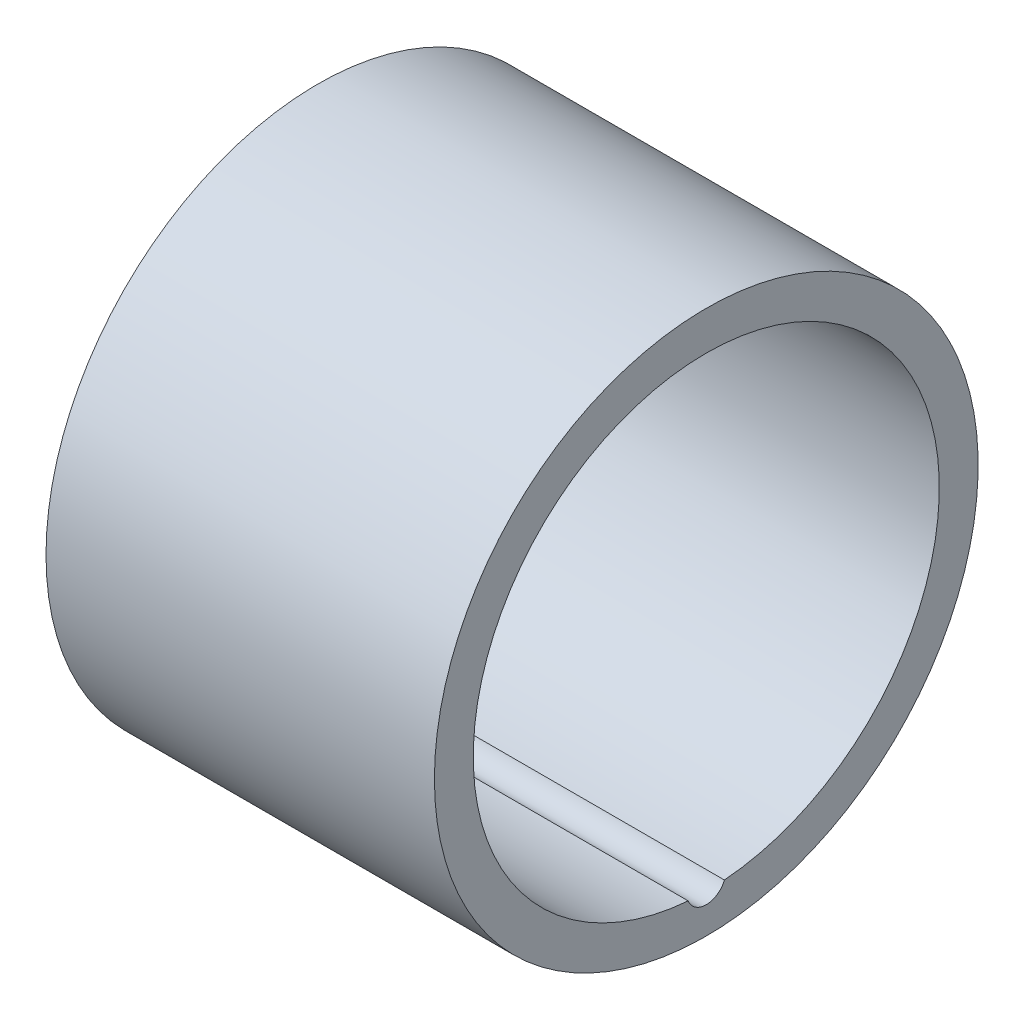
ISO-10303-21;
HEADER;
FILE_DESCRIPTION(('STEP AP214'),'2;1');
FILE_NAME('part.step','',(''),(''),'','','');
FILE_SCHEMA(('AUTOMOTIVE_DESIGN { 1 0 10303 214 1 1 1 1 }'));
ENDSEC;
DATA;
#1=APPLICATION_CONTEXT('core data for automotive mechanical design processes');
#2=APPLICATION_PROTOCOL_DEFINITION('international standard','automotive_design',2000,#1);
#3=PRODUCT_CONTEXT('',#1,'mechanical');
#4=PRODUCT('Part','Part','',(#3));
#5=PRODUCT_RELATED_PRODUCT_CATEGORY('part','',(#4));
#6=PRODUCT_DEFINITION_FORMATION('','',#4);
#7=PRODUCT_DEFINITION_CONTEXT('part definition',#1,'design');
#8=PRODUCT_DEFINITION('design','',#6,#7);
#9=PRODUCT_DEFINITION_SHAPE('','',#8);
#10=(LENGTH_UNIT() NAMED_UNIT(*) SI_UNIT(.MILLI.,.METRE.));
#11=(NAMED_UNIT(*) PLANE_ANGLE_UNIT() SI_UNIT($,.RADIAN.));
#12=(NAMED_UNIT(*) SI_UNIT($,.STERADIAN.) SOLID_ANGLE_UNIT());
#13=UNCERTAINTY_MEASURE_WITH_UNIT(LENGTH_MEASURE(1.E-05),#10,'distance_accuracy_value','');
#14=(GEOMETRIC_REPRESENTATION_CONTEXT(3) GLOBAL_UNCERTAINTY_ASSIGNED_CONTEXT((#13)) GLOBAL_UNIT_ASSIGNED_CONTEXT((#10,
#11,#12)) REPRESENTATION_CONTEXT('',''));
#15=CARTESIAN_POINT('',(0.,0.,0.));
#16=DIRECTION('',(0.,0.,1.));
#17=DIRECTION('',(1.,0.,0.));
#18=AXIS2_PLACEMENT_3D('',#15,#16,#17);
#19=CARTESIAN_POINT('',(0.,0.,0.));
#20=DIRECTION('',(-1.,0.,0.));
#21=DIRECTION('',(0.,0.,1.));
#22=AXIS2_PLACEMENT_3D('',#19,#20,#21);
#23=CYLINDRICAL_SURFACE('',#22,6.);
#24=DIRECTION('',(-1.,0.,0.));
#25=VECTOR('',#24,1.);
#26=CARTESIAN_POINT('',(5.,-5.98189655172414,0.465739889284639));
#27=LINE('',#26,#25);
#28=CARTESIAN_POINT('',(0.,-5.98189655172414,0.46573988928464));
#29=VERTEX_POINT('',#28);
#30=CARTESIAN_POINT('',(10.,-5.98189655172414,0.465739889284641));
#31=VERTEX_POINT('',#30);
#32=EDGE_CURVE('E49',#29,#31,#27,.F.);
#33=ORIENTED_EDGE('',*,*,#32,.F.);
#34=CARTESIAN_POINT('',(0.,0.,0.));
#35=DIRECTION('',(-1.,0.,0.));
#36=DIRECTION('',(0.,0.,1.));
#37=AXIS2_PLACEMENT_3D('',#34,#35,#36);
#38=CIRCLE('',#37,6.);
#39=CARTESIAN_POINT('',(0.,-5.98189655172414,-0.46573988928464));
#40=VERTEX_POINT('',#39);
#41=EDGE_CURVE('E11',#29,#40,#38,.T.);
#42=ORIENTED_EDGE('',*,*,#41,.T.);
#43=DIRECTION('',(-1.,0.,0.));
#44=VECTOR('',#43,1.);
#45=CARTESIAN_POINT('',(5.,-5.98189655172414,-0.465739889284639));
#46=LINE('',#45,#44);
#47=CARTESIAN_POINT('',(10.,-5.98189655172414,-0.46573988928464));
#48=VERTEX_POINT('',#47);
#49=EDGE_CURVE('E54',#48,#40,#46,.T.);
#50=ORIENTED_EDGE('',*,*,#49,.F.);
#51=CARTESIAN_POINT('',(10.,0.,0.));
#52=DIRECTION('',(-1.,0.,0.));
#53=DIRECTION('',(0.,0.,1.));
#54=AXIS2_PLACEMENT_3D('',#51,#52,#53);
#55=CIRCLE('',#54,6.);
#56=EDGE_CURVE('E67',#31,#48,#55,.T.);
#57=ORIENTED_EDGE('',*,*,#56,.F.);
#58=EDGE_LOOP('',(#33,#42,#50,#57));
#59=FACE_BOUND('',#58,.T.);
#60=ADVANCED_FACE('F35',(#59),#23,.F.);
#61=CARTESIAN_POINT('',(0.,6.,0.));
#62=DIRECTION('',(-1.,0.,0.));
#63=DIRECTION('',(0.,0.,1.));
#64=AXIS2_PLACEMENT_3D('',#61,#62,#63);
#65=PLANE('',#64);
#66=CARTESIAN_POINT('',(0.,0.,0.));
#67=DIRECTION('',(-1.,0.,0.));
#68=DIRECTION('',(0.,0.,1.));
#69=AXIS2_PLACEMENT_3D('',#66,#67,#68);
#70=CIRCLE('',#69,7.);
#71=CARTESIAN_POINT('',(0.,0.,7.));
#72=VERTEX_POINT('',#71);
#73=EDGE_CURVE('E42',#72,#72,#70,.T.);
#74=ORIENTED_EDGE('',*,*,#73,.T.);
#75=EDGE_LOOP('',(#74));
#76=FACE_BOUND('',#75,.T.);
#77=ORIENTED_EDGE('',*,*,#41,.F.);
#78=CARTESIAN_POINT('',(0.,-5.8,0.));
#79=DIRECTION('',(1.,0.,0.));
#80=DIRECTION('',(0.,0.,-1.));
#81=AXIS2_PLACEMENT_3D('',#78,#79,#80);
#82=CIRCLE('',#81,0.5);
#83=EDGE_CURVE('E64',#29,#40,#82,.T.);
#84=ORIENTED_EDGE('',*,*,#83,.T.);
#85=EDGE_LOOP('',(#77,#84));
#86=FACE_BOUND('',#85,.T.);
#87=ADVANCED_FACE('F79',(#76,#86),#65,.T.);
#88=CARTESIAN_POINT('',(10.,7.,0.));
#89=DIRECTION('',(1.,0.,0.));
#90=DIRECTION('',(0.,0.,-1.));
#91=AXIS2_PLACEMENT_3D('',#88,#89,#90);
#92=PLANE('',#91);
#93=CARTESIAN_POINT('',(10.,0.,0.));
#94=DIRECTION('',(-1.,0.,0.));
#95=DIRECTION('',(0.,0.,1.));
#96=AXIS2_PLACEMENT_3D('',#93,#94,#95);
#97=CIRCLE('',#96,7.);
#98=CARTESIAN_POINT('',(10.,0.,7.));
#99=VERTEX_POINT('',#98);
#100=EDGE_CURVE('E71',#99,#99,#97,.T.);
#101=ORIENTED_EDGE('',*,*,#100,.F.);
#102=EDGE_LOOP('',(#101));
#103=FACE_BOUND('',#102,.T.);
#104=ORIENTED_EDGE('',*,*,#56,.T.);
#105=CARTESIAN_POINT('',(10.,-5.8,0.));
#106=DIRECTION('',(1.,0.,0.));
#107=DIRECTION('',(0.,0.,-1.));
#108=AXIS2_PLACEMENT_3D('',#105,#106,#107);
#109=CIRCLE('',#108,0.5);
#110=EDGE_CURVE('E59',#31,#48,#109,.T.);
#111=ORIENTED_EDGE('',*,*,#110,.F.);
#112=EDGE_LOOP('',(#104,#111));
#113=FACE_BOUND('',#112,.T.);
#114=ADVANCED_FACE('F70',(#103,#113),#92,.T.);
#115=CARTESIAN_POINT('',(0.,0.,0.));
#116=DIRECTION('',(-1.,0.,0.));
#117=DIRECTION('',(0.,0.,1.));
#118=AXIS2_PLACEMENT_3D('',#115,#116,#117);
#119=CYLINDRICAL_SURFACE('',#118,7.);
#120=ORIENTED_EDGE('',*,*,#100,.T.);
#121=EDGE_LOOP('',(#120));
#122=FACE_BOUND('',#121,.T.);
#123=ORIENTED_EDGE('',*,*,#73,.F.);
#124=EDGE_LOOP('',(#123));
#125=FACE_BOUND('',#124,.T.);
#126=ADVANCED_FACE('F82',(#122,#125),#119,.T.);
#127=CARTESIAN_POINT('',(10.,-5.8,0.));
#128=DIRECTION('',(-1.,0.,0.));
#129=DIRECTION('',(0.,0.,1.));
#130=AXIS2_PLACEMENT_3D('',#127,#128,#129);
#131=CYLINDRICAL_SURFACE('',#130,0.5);
#132=ORIENTED_EDGE('',*,*,#32,.T.);
#133=ORIENTED_EDGE('',*,*,#110,.T.);
#134=ORIENTED_EDGE('',*,*,#49,.T.);
#135=ORIENTED_EDGE('',*,*,#83,.F.);
#136=EDGE_LOOP('',(#132,#133,#134,#135));
#137=FACE_BOUND('',#136,.T.);
#138=ADVANCED_FACE('F60',(#137),#131,.F.);
#139=CLOSED_SHELL('',(#60,#87,#114,#126,#138));
#140=MANIFOLD_SOLID_BREP('B2',#139);
#141=ADVANCED_BREP_SHAPE_REPRESENTATION('',(#18,#140),#14);
#142=SHAPE_DEFINITION_REPRESENTATION(#9,#141);
ENDSEC;
END-ISO-10303-21;
